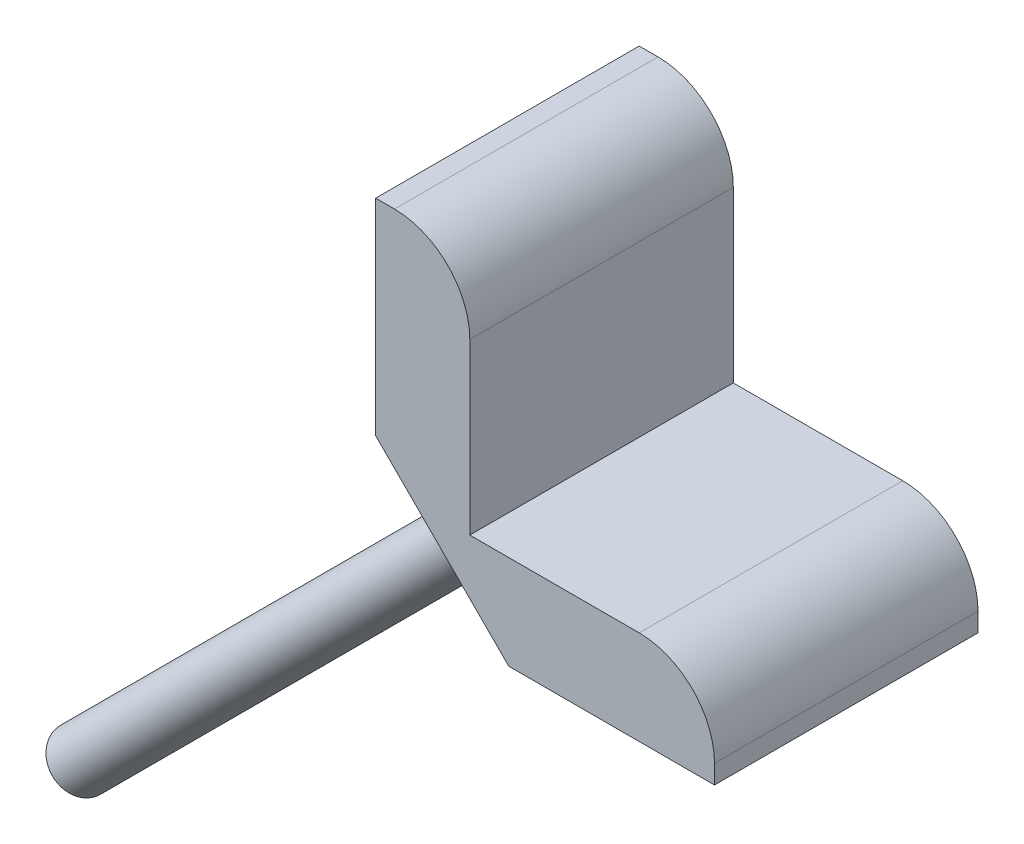
ISO-10303-21;
HEADER;
FILE_DESCRIPTION(('STEP AP214'),'2;1');
FILE_NAME('part.step','',(''),(''),'','','');
FILE_SCHEMA(('AUTOMOTIVE_DESIGN { 1 0 10303 214 1 1 1 1 }'));
ENDSEC;
DATA;
#1=APPLICATION_CONTEXT('core data for automotive mechanical design processes');
#2=APPLICATION_PROTOCOL_DEFINITION('international standard','automotive_design',2000,#1);
#3=PRODUCT_CONTEXT('',#1,'mechanical');
#4=PRODUCT('Part','Part','',(#3));
#5=PRODUCT_RELATED_PRODUCT_CATEGORY('part','',(#4));
#6=PRODUCT_DEFINITION_FORMATION('','',#4);
#7=PRODUCT_DEFINITION_CONTEXT('part definition',#1,'design');
#8=PRODUCT_DEFINITION('design','',#6,#7);
#9=PRODUCT_DEFINITION_SHAPE('','',#8);
#10=(LENGTH_UNIT() NAMED_UNIT(*) SI_UNIT(.MILLI.,.METRE.));
#11=(NAMED_UNIT(*) PLANE_ANGLE_UNIT() SI_UNIT($,.RADIAN.));
#12=(NAMED_UNIT(*) SI_UNIT($,.STERADIAN.) SOLID_ANGLE_UNIT());
#13=UNCERTAINTY_MEASURE_WITH_UNIT(LENGTH_MEASURE(1.E-05),#10,'distance_accuracy_value','');
#14=(GEOMETRIC_REPRESENTATION_CONTEXT(3) GLOBAL_UNCERTAINTY_ASSIGNED_CONTEXT((#13)) GLOBAL_UNIT_ASSIGNED_CONTEXT((#10,
#11,#12)) REPRESENTATION_CONTEXT('',''));
#15=CARTESIAN_POINT('',(0.,0.,0.));
#16=DIRECTION('',(0.,0.,1.));
#17=DIRECTION('',(1.,0.,0.));
#18=AXIS2_PLACEMENT_3D('',#15,#16,#17);
#19=CARTESIAN_POINT('',(0.,90.,-80.));
#20=DIRECTION('',(0.,0.,1.));
#21=DIRECTION('',(1.,0.,0.));
#22=AXIS2_PLACEMENT_3D('',#19,#20,#21);
#23=PLANE('',#22);
#24=DIRECTION('',(-1.,0.,0.));
#25=VECTOR('',#24,1.);
#26=CARTESIAN_POINT('',(0.,0.,-80.));
#27=LINE('',#26,#25);
#28=CARTESIAN_POINT('',(0.,0.,-80.));
#29=VERTEX_POINT('',#28);
#30=CARTESIAN_POINT('',(-54.6446609406726,0.,-80.));
#31=VERTEX_POINT('',#30);
#32=EDGE_CURVE('E234',#29,#31,#27,.T.);
#33=ORIENTED_EDGE('',*,*,#32,.T.);
#34=DIRECTION('',(0.707106781186547,-0.707106781186547,0.));
#35=VECTOR('',#34,1.);
#36=CARTESIAN_POINT('',(-54.6446609406726,0.,-80.));
#37=LINE('',#36,#35);
#38=CARTESIAN_POINT('',(-90.,35.3553390593274,-80.));
#39=VERTEX_POINT('',#38);
#40=EDGE_CURVE('E74',#39,#31,#37,.T.);
#41=ORIENTED_EDGE('',*,*,#40,.F.);
#42=DIRECTION('',(0.,-1.,0.));
#43=VECTOR('',#42,1.);
#44=CARTESIAN_POINT('',(-90.,90.,-80.));
#45=LINE('',#44,#43);
#46=CARTESIAN_POINT('',(-90.,90.,-80.));
#47=VERTEX_POINT('',#46);
#48=EDGE_CURVE('E224',#47,#39,#45,.T.);
#49=ORIENTED_EDGE('',*,*,#48,.F.);
#50=DIRECTION('',(-1.,0.,0.));
#51=VECTOR('',#50,1.);
#52=CARTESIAN_POINT('',(0.,90.,-80.));
#53=LINE('',#52,#51);
#54=CARTESIAN_POINT('',(-85.,90.,-80.));
#55=VERTEX_POINT('',#54);
#56=EDGE_CURVE('E233',#55,#47,#53,.T.);
#57=ORIENTED_EDGE('',*,*,#56,.F.);
#58=CARTESIAN_POINT('',(-85.,70.,-80.));
#59=DIRECTION('',(0.,0.,1.));
#60=DIRECTION('',(1.,0.,0.));
#61=AXIS2_PLACEMENT_3D('',#58,#59,#60);
#62=CIRCLE('',#61,20.);
#63=CARTESIAN_POINT('',(-65.,70.,-80.));
#64=VERTEX_POINT('',#63);
#65=EDGE_CURVE('E217',#55,#64,#62,.F.);
#66=ORIENTED_EDGE('',*,*,#65,.T.);
#67=DIRECTION('',(0.,1.,0.));
#68=VECTOR('',#67,1.);
#69=CARTESIAN_POINT('',(-65.,25.,-80.));
#70=LINE('',#69,#68);
#71=CARTESIAN_POINT('',(-65.,25.,-80.));
#72=VERTEX_POINT('',#71);
#73=EDGE_CURVE('E245',#72,#64,#70,.T.);
#74=ORIENTED_EDGE('',*,*,#73,.F.);
#75=DIRECTION('',(-1.,0.,0.));
#76=VECTOR('',#75,1.);
#77=CARTESIAN_POINT('',(0.,25.,-80.));
#78=LINE('',#77,#76);
#79=CARTESIAN_POINT('',(-20.,25.,-80.));
#80=VERTEX_POINT('',#79);
#81=EDGE_CURVE('E249',#80,#72,#78,.T.);
#82=ORIENTED_EDGE('',*,*,#81,.F.);
#83=CARTESIAN_POINT('',(-20.,4.99999999999999,-80.));
#84=DIRECTION('',(0.,0.,1.));
#85=DIRECTION('',(1.,0.,0.));
#86=AXIS2_PLACEMENT_3D('',#83,#84,#85);
#87=CIRCLE('',#86,20.);
#88=CARTESIAN_POINT('',(0.,5.00000000000002,-80.));
#89=VERTEX_POINT('',#88);
#90=EDGE_CURVE('E213',#80,#89,#87,.F.);
#91=ORIENTED_EDGE('',*,*,#90,.T.);
#92=DIRECTION('',(0.,-1.,0.));
#93=VECTOR('',#92,1.);
#94=CARTESIAN_POINT('',(0.,90.,-80.));
#95=LINE('',#94,#93);
#96=EDGE_CURVE('E211',#89,#29,#95,.T.);
#97=ORIENTED_EDGE('',*,*,#96,.T.);
#98=EDGE_LOOP('',(#33,#41,#49,#57,#66,#74,#82,#91,#97));
#99=FACE_BOUND('',#98,.T.);
#100=ADVANCED_FACE('F51',(#99),#23,.F.);
#101=CARTESIAN_POINT('',(-90.,90.,0.));
#102=DIRECTION('',(-1.,0.,0.));
#103=DIRECTION('',(0.,0.,1.));
#104=AXIS2_PLACEMENT_3D('',#101,#102,#103);
#105=PLANE('',#104);
#106=DIRECTION('',(0.,-1.,0.));
#107=VECTOR('',#106,1.);
#108=CARTESIAN_POINT('',(-90.,90.,-10.));
#109=LINE('',#108,#107);
#110=CARTESIAN_POINT('',(-90.,90.,-10.));
#111=VERTEX_POINT('',#110);
#112=CARTESIAN_POINT('',(-90.,35.3553390593274,-9.99999999999999));
#113=VERTEX_POINT('',#112);
#114=EDGE_CURVE('E67',#111,#113,#109,.T.);
#115=ORIENTED_EDGE('',*,*,#114,.F.);
#116=DIRECTION('',(0.,0.,-1.));
#117=VECTOR('',#116,1.);
#118=CARTESIAN_POINT('',(-90.,90.,0.));
#119=LINE('',#118,#117);
#120=EDGE_CURVE('E230',#111,#47,#119,.T.);
#121=ORIENTED_EDGE('',*,*,#120,.T.);
#122=ORIENTED_EDGE('',*,*,#48,.T.);
#123=DIRECTION('',(0.,0.,-1.));
#124=VECTOR('',#123,1.);
#125=CARTESIAN_POINT('',(-90.,35.3553390593274,20.));
#126=LINE('',#125,#124);
#127=EDGE_CURVE('E253',#113,#39,#126,.T.);
#128=ORIENTED_EDGE('',*,*,#127,.F.);
#129=EDGE_LOOP('',(#115,#121,#122,#128));
#130=FACE_BOUND('',#129,.T.);
#131=ADVANCED_FACE('F173',(#130),#105,.T.);
#132=CARTESIAN_POINT('',(0.,90.,0.));
#133=DIRECTION('',(-1.,0.,0.));
#134=DIRECTION('',(0.,0.,1.));
#135=AXIS2_PLACEMENT_3D('',#132,#133,#134);
#136=PLANE('',#135);
#137=DIRECTION('',(0.,0.,-1.));
#138=VECTOR('',#137,1.);
#139=CARTESIAN_POINT('',(0.,4.99999999999999,0.));
#140=LINE('',#139,#138);
#141=CARTESIAN_POINT('',(0.,5.00000000000002,-9.99999999999999));
#142=VERTEX_POINT('',#141);
#143=EDGE_CURVE('E202',#89,#142,#140,.F.);
#144=ORIENTED_EDGE('',*,*,#143,.T.);
#145=DIRECTION('',(0.,-1.,0.));
#146=VECTOR('',#145,1.);
#147=CARTESIAN_POINT('',(0.,90.,-10.));
#148=LINE('',#147,#146);
#149=CARTESIAN_POINT('',(0.,0.,-9.99999999999998));
#150=VERTEX_POINT('',#149);
#151=EDGE_CURVE('E134',#142,#150,#148,.T.);
#152=ORIENTED_EDGE('',*,*,#151,.T.);
#153=DIRECTION('',(0.,0.,-1.));
#154=VECTOR('',#153,1.);
#155=CARTESIAN_POINT('',(0.,0.,0.));
#156=LINE('',#155,#154);
#157=EDGE_CURVE('E131',#150,#29,#156,.T.);
#158=ORIENTED_EDGE('',*,*,#157,.T.);
#159=ORIENTED_EDGE('',*,*,#96,.F.);
#160=EDGE_LOOP('',(#144,#152,#158,#159));
#161=FACE_BOUND('',#160,.T.);
#162=ADVANCED_FACE('F180',(#161),#136,.F.);
#163=CARTESIAN_POINT('',(0.,90.,0.));
#164=DIRECTION('',(0.,-1.,0.));
#165=DIRECTION('',(0.,0.,-1.));
#166=AXIS2_PLACEMENT_3D('',#163,#164,#165);
#167=PLANE('',#166);
#168=ORIENTED_EDGE('',*,*,#120,.F.);
#169=DIRECTION('',(1.,0.,0.));
#170=VECTOR('',#169,1.);
#171=CARTESIAN_POINT('',(0.,90.,-10.));
#172=LINE('',#171,#170);
#173=CARTESIAN_POINT('',(-85.,90.,-10.));
#174=VERTEX_POINT('',#173);
#175=EDGE_CURVE('E271',#111,#174,#172,.T.);
#176=ORIENTED_EDGE('',*,*,#175,.T.);
#177=DIRECTION('',(0.,0.,-1.));
#178=VECTOR('',#177,1.);
#179=CARTESIAN_POINT('',(-85.,90.,0.));
#180=LINE('',#179,#178);
#181=EDGE_CURVE('E146',#174,#55,#180,.T.);
#182=ORIENTED_EDGE('',*,*,#181,.T.);
#183=ORIENTED_EDGE('',*,*,#56,.T.);
#184=EDGE_LOOP('',(#168,#176,#182,#183));
#185=FACE_BOUND('',#184,.T.);
#186=ADVANCED_FACE('F286',(#185),#167,.F.);
#187=CARTESIAN_POINT('',(0.,0.,0.));
#188=DIRECTION('',(0.,-1.,0.));
#189=DIRECTION('',(0.,0.,-1.));
#190=AXIS2_PLACEMENT_3D('',#187,#188,#189);
#191=PLANE('',#190);
#192=DIRECTION('',(1.,0.,0.));
#193=VECTOR('',#192,1.);
#194=CARTESIAN_POINT('',(0.,0.,-9.99999999999998));
#195=LINE('',#194,#193);
#196=CARTESIAN_POINT('',(-54.6446609406726,0.,-9.99999999999999));
#197=VERTEX_POINT('',#196);
#198=EDGE_CURVE('E122',#197,#150,#195,.T.);
#199=ORIENTED_EDGE('',*,*,#198,.F.);
#200=DIRECTION('',(0.,0.,1.));
#201=VECTOR('',#200,1.);
#202=CARTESIAN_POINT('',(-54.6446609406726,0.,0.));
#203=LINE('',#202,#201);
#204=EDGE_CURVE('E129',#31,#197,#203,.T.);
#205=ORIENTED_EDGE('',*,*,#204,.F.);
#206=ORIENTED_EDGE('',*,*,#32,.F.);
#207=ORIENTED_EDGE('',*,*,#157,.F.);
#208=EDGE_LOOP('',(#199,#205,#206,#207));
#209=FACE_BOUND('',#208,.T.);
#210=ADVANCED_FACE('F127',(#209),#191,.T.);
#211=CARTESIAN_POINT('',(-65.,25.,20.));
#212=DIRECTION('',(-1.,0.,0.));
#213=DIRECTION('',(0.,0.,1.));
#214=AXIS2_PLACEMENT_3D('',#211,#212,#213);
#215=PLANE('',#214);
#216=DIRECTION('',(0.,0.,-1.));
#217=VECTOR('',#216,1.);
#218=CARTESIAN_POINT('',(-65.,70.,20.));
#219=LINE('',#218,#217);
#220=CARTESIAN_POINT('',(-65.,70.,-10.));
#221=VERTEX_POINT('',#220);
#222=EDGE_CURVE('E139',#64,#221,#219,.F.);
#223=ORIENTED_EDGE('',*,*,#222,.T.);
#224=DIRECTION('',(0.,-1.,0.));
#225=VECTOR('',#224,1.);
#226=CARTESIAN_POINT('',(-65.,25.,-9.99999999999999));
#227=LINE('',#226,#225);
#228=CARTESIAN_POINT('',(-65.,25.,-9.99999999999999));
#229=VERTEX_POINT('',#228);
#230=EDGE_CURVE('E275',#221,#229,#227,.T.);
#231=ORIENTED_EDGE('',*,*,#230,.T.);
#232=DIRECTION('',(0.,0.,-1.));
#233=VECTOR('',#232,1.);
#234=CARTESIAN_POINT('',(-65.,25.,20.));
#235=LINE('',#234,#233);
#236=EDGE_CURVE('E237',#229,#72,#235,.T.);
#237=ORIENTED_EDGE('',*,*,#236,.T.);
#238=ORIENTED_EDGE('',*,*,#73,.T.);
#239=EDGE_LOOP('',(#223,#231,#237,#238));
#240=FACE_BOUND('',#239,.T.);
#241=ADVANCED_FACE('F193',(#240),#215,.F.);
#242=CARTESIAN_POINT('',(0.,25.,20.));
#243=DIRECTION('',(0.,-1.,0.));
#244=DIRECTION('',(0.,0.,-1.));
#245=AXIS2_PLACEMENT_3D('',#242,#243,#244);
#246=PLANE('',#245);
#247=ORIENTED_EDGE('',*,*,#236,.F.);
#248=DIRECTION('',(1.,0.,0.));
#249=VECTOR('',#248,1.);
#250=CARTESIAN_POINT('',(0.,25.,-9.99999999999999));
#251=LINE('',#250,#249);
#252=CARTESIAN_POINT('',(-20.,25.,-9.99999999999999));
#253=VERTEX_POINT('',#252);
#254=EDGE_CURVE('E206',#229,#253,#251,.T.);
#255=ORIENTED_EDGE('',*,*,#254,.T.);
#256=DIRECTION('',(0.,0.,-1.));
#257=VECTOR('',#256,1.);
#258=CARTESIAN_POINT('',(-20.,25.,20.));
#259=LINE('',#258,#257);
#260=EDGE_CURVE('E203',#253,#80,#259,.T.);
#261=ORIENTED_EDGE('',*,*,#260,.T.);
#262=ORIENTED_EDGE('',*,*,#81,.T.);
#263=EDGE_LOOP('',(#247,#255,#261,#262));
#264=FACE_BOUND('',#263,.T.);
#265=ADVANCED_FACE('F186',(#264),#246,.F.);
#266=CARTESIAN_POINT('',(-20.,4.99999999999999,20.));
#267=DIRECTION('',(0.,0.,-1.));
#268=DIRECTION('',(-1.,0.,0.));
#269=AXIS2_PLACEMENT_3D('',#266,#267,#268);
#270=CYLINDRICAL_SURFACE('',#269,20.);
#271=CARTESIAN_POINT('',(-20.,4.99999999999999,-9.99999999999999));
#272=DIRECTION('',(0.,0.,-1.));
#273=DIRECTION('',(0.,1.,0.));
#274=AXIS2_PLACEMENT_3D('',#271,#272,#273);
#275=CIRCLE('',#274,20.);
#276=EDGE_CURVE('E199',#142,#253,#275,.F.);
#277=ORIENTED_EDGE('',*,*,#276,.F.);
#278=ORIENTED_EDGE('',*,*,#143,.F.);
#279=ORIENTED_EDGE('',*,*,#90,.F.);
#280=ORIENTED_EDGE('',*,*,#260,.F.);
#281=EDGE_LOOP('',(#277,#278,#279,#280));
#282=FACE_BOUND('',#281,.T.);
#283=ADVANCED_FACE('F184',(#282),#270,.T.);
#284=CARTESIAN_POINT('',(-85.,70.,0.));
#285=DIRECTION('',(0.,0.,-1.));
#286=DIRECTION('',(-1.,0.,0.));
#287=AXIS2_PLACEMENT_3D('',#284,#285,#286);
#288=CYLINDRICAL_SURFACE('',#287,20.);
#289=CARTESIAN_POINT('',(-85.,70.,-10.));
#290=DIRECTION('',(0.,0.,-1.));
#291=DIRECTION('',(0.,1.,0.));
#292=AXIS2_PLACEMENT_3D('',#289,#290,#291);
#293=CIRCLE('',#292,20.);
#294=EDGE_CURVE('E279',#221,#174,#293,.F.);
#295=ORIENTED_EDGE('',*,*,#294,.F.);
#296=ORIENTED_EDGE('',*,*,#222,.F.);
#297=ORIENTED_EDGE('',*,*,#65,.F.);
#298=ORIENTED_EDGE('',*,*,#181,.F.);
#299=EDGE_LOOP('',(#295,#296,#297,#298));
#300=FACE_BOUND('',#299,.T.);
#301=ADVANCED_FACE('F53',(#300),#288,.T.);
#302=CARTESIAN_POINT('',(-54.6446609406726,0.,20.));
#303=DIRECTION('',(0.707106781186547,0.707106781186547,0.));
#304=DIRECTION('',(-0.707106781186548,0.707106781186548,0.));
#305=AXIS2_PLACEMENT_3D('',#302,#303,#304);
#306=PLANE('',#305);
#307=CARTESIAN_POINT('',(-72.3223304703363,17.6776695296637,-60.));
#308=DIRECTION('',(0.707106781186547,0.707106781186547,0.));
#309=DIRECTION('',(-0.707106781186548,0.707106781186548,0.));
#310=AXIS2_PLACEMENT_3D('',#307,#308,#309);
#311=CIRCLE('',#310,7.5);
#312=CARTESIAN_POINT('',(-77.6256313292354,22.9809703885628,-60.));
#313=VERTEX_POINT('',#312);
#314=EDGE_CURVE('E60',#313,#313,#311,.F.);
#315=ORIENTED_EDGE('',*,*,#314,.F.);
#316=EDGE_LOOP('',(#315));
#317=FACE_BOUND('',#316,.T.);
#318=CARTESIAN_POINT('',(-72.3223304703363,17.6776695296637,-20.));
#319=DIRECTION('',(0.707106781186547,0.707106781186547,0.));
#320=DIRECTION('',(-0.707106781186548,0.707106781186548,0.));
#321=AXIS2_PLACEMENT_3D('',#318,#319,#320);
#322=CIRCLE('',#321,7.5);
#323=CARTESIAN_POINT('',(-77.6256313292354,22.9809703885628,-20.));
#324=VERTEX_POINT('',#323);
#325=EDGE_CURVE('E138',#324,#324,#322,.F.);
#326=ORIENTED_EDGE('',*,*,#325,.F.);
#327=EDGE_LOOP('',(#326));
#328=FACE_BOUND('',#327,.T.);
#329=ORIENTED_EDGE('',*,*,#204,.T.);
#330=DIRECTION('',(-0.707106781186548,0.707106781186548,0.));
#331=VECTOR('',#330,1.);
#332=CARTESIAN_POINT('',(-54.6446609406726,0.,-9.99999999999999));
#333=LINE('',#332,#331);
#334=EDGE_CURVE('E11',#197,#113,#333,.T.);
#335=ORIENTED_EDGE('',*,*,#334,.T.);
#336=ORIENTED_EDGE('',*,*,#127,.T.);
#337=ORIENTED_EDGE('',*,*,#40,.T.);
#338=EDGE_LOOP('',(#329,#335,#336,#337));
#339=FACE_BOUND('',#338,.T.);
#340=ADVANCED_FACE('F136',(#317,#328,#339),#306,.F.);
#341=CARTESIAN_POINT('',(-178.388347648318,-88.3883476483184,-20.));
#342=DIRECTION('',(0.707106781186548,0.707106781186547,0.));
#343=DIRECTION('',(-0.707106781186547,0.707106781186548,0.));
#344=AXIS2_PLACEMENT_3D('',#341,#342,#343);
#345=CYLINDRICAL_SURFACE('',#344,7.5);
#346=CARTESIAN_POINT('',(-178.388347648318,-88.3883476483184,-20.));
#347=DIRECTION('',(-0.707106781186548,-0.707106781186547,0.));
#348=DIRECTION('',(0.707106781186547,-0.707106781186548,0.));
#349=AXIS2_PLACEMENT_3D('',#346,#347,#348);
#350=CIRCLE('',#349,7.5);
#351=CARTESIAN_POINT('',(-173.085046789419,-93.6916485072175,-20.));
#352=VERTEX_POINT('',#351);
#353=EDGE_CURVE('E133',#352,#352,#350,.T.);
#354=ORIENTED_EDGE('',*,*,#353,.F.);
#355=EDGE_LOOP('',(#354));
#356=FACE_BOUND('',#355,.T.);
#357=ORIENTED_EDGE('',*,*,#325,.T.);
#358=EDGE_LOOP('',(#357));
#359=FACE_BOUND('',#358,.T.);
#360=ADVANCED_FACE('F157',(#356,#359),#345,.T.);
#361=CARTESIAN_POINT('',(-178.388347648318,-88.3883476483184,-20.));
#362=DIRECTION('',(-0.707106781186548,-0.707106781186547,0.));
#363=DIRECTION('',(0.707106781186547,-0.707106781186548,0.));
#364=AXIS2_PLACEMENT_3D('',#361,#362,#363);
#365=PLANE('',#364);
#366=ORIENTED_EDGE('',*,*,#353,.T.);
#367=EDGE_LOOP('',(#366));
#368=FACE_BOUND('',#367,.T.);
#369=ADVANCED_FACE('F162',(#368),#365,.T.);
#370=CARTESIAN_POINT('',(-178.388347648318,-88.3883476483184,-60.));
#371=DIRECTION('',(0.707106781186548,0.707106781186547,0.));
#372=DIRECTION('',(-0.707106781186547,0.707106781186548,0.));
#373=AXIS2_PLACEMENT_3D('',#370,#371,#372);
#374=CYLINDRICAL_SURFACE('',#373,7.5);
#375=CARTESIAN_POINT('',(-178.388347648318,-88.3883476483184,-60.));
#376=DIRECTION('',(-0.707106781186548,-0.707106781186547,0.));
#377=DIRECTION('',(0.707106781186547,-0.707106781186548,0.));
#378=AXIS2_PLACEMENT_3D('',#375,#376,#377);
#379=CIRCLE('',#378,7.5);
#380=CARTESIAN_POINT('',(-173.085046789419,-93.6916485072175,-60.));
#381=VERTEX_POINT('',#380);
#382=EDGE_CURVE('E258',#381,#381,#379,.T.);
#383=ORIENTED_EDGE('',*,*,#382,.F.);
#384=EDGE_LOOP('',(#383));
#385=FACE_BOUND('',#384,.T.);
#386=ORIENTED_EDGE('',*,*,#314,.T.);
#387=EDGE_LOOP('',(#386));
#388=FACE_BOUND('',#387,.T.);
#389=ADVANCED_FACE('F153',(#385,#388),#374,.T.);
#390=CARTESIAN_POINT('',(-178.388347648318,-88.3883476483184,-60.));
#391=DIRECTION('',(-0.707106781186548,-0.707106781186547,0.));
#392=DIRECTION('',(0.707106781186547,-0.707106781186548,0.));
#393=AXIS2_PLACEMENT_3D('',#390,#391,#392);
#394=PLANE('',#393);
#395=ORIENTED_EDGE('',*,*,#382,.T.);
#396=EDGE_LOOP('',(#395));
#397=FACE_BOUND('',#396,.T.);
#398=ADVANCED_FACE('F371',(#397),#394,.T.);
#399=CARTESIAN_POINT('',(-44.9999999999999,135.,-10.));
#400=DIRECTION('',(0.,0.,-1.));
#401=DIRECTION('',(0.,1.,0.));
#402=AXIS2_PLACEMENT_3D('',#399,#400,#401);
#403=PLANE('',#402);
#404=ORIENTED_EDGE('',*,*,#198,.T.);
#405=ORIENTED_EDGE('',*,*,#151,.F.);
#406=ORIENTED_EDGE('',*,*,#276,.T.);
#407=ORIENTED_EDGE('',*,*,#254,.F.);
#408=ORIENTED_EDGE('',*,*,#230,.F.);
#409=ORIENTED_EDGE('',*,*,#294,.T.);
#410=ORIENTED_EDGE('',*,*,#175,.F.);
#411=ORIENTED_EDGE('',*,*,#114,.T.);
#412=ORIENTED_EDGE('',*,*,#334,.F.);
#413=EDGE_LOOP('',(#404,#405,#406,#407,#408,#409,#410,#411,#412));
#414=FACE_BOUND('',#413,.T.);
#415=ADVANCED_FACE('F121',(#414),#403,.F.);
#416=CLOSED_SHELL('',(#100,#131,#162,#186,#210,#241,#265,#283,#301,#340,#360,#369,#389,#398,#415));
#417=MANIFOLD_SOLID_BREP('B2',#416);
#418=ADVANCED_BREP_SHAPE_REPRESENTATION('',(#18,#417),#14);
#419=SHAPE_DEFINITION_REPRESENTATION(#9,#418);
ENDSEC;
END-ISO-10303-21;
